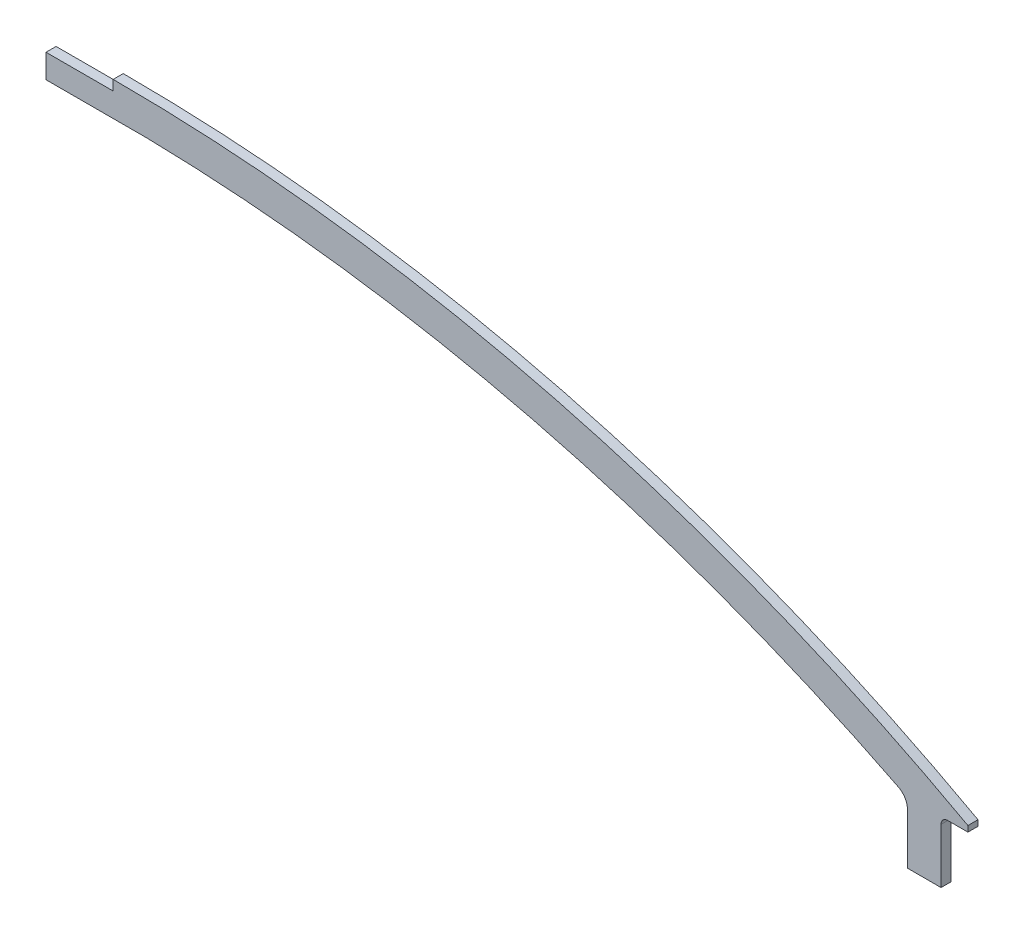
ISO-10303-21;
HEADER;
FILE_DESCRIPTION(('STEP AP214'),'2;1');
FILE_NAME('part.step','',(''),(''),'','','');
FILE_SCHEMA(('AUTOMOTIVE_DESIGN { 1 0 10303 214 1 1 1 1 }'));
ENDSEC;
DATA;
#1=APPLICATION_CONTEXT('core data for automotive mechanical design processes');
#2=APPLICATION_PROTOCOL_DEFINITION('international standard','automotive_design',2000,#1);
#3=PRODUCT_CONTEXT('',#1,'mechanical');
#4=PRODUCT('Part','Part','',(#3));
#5=PRODUCT_RELATED_PRODUCT_CATEGORY('part','',(#4));
#6=PRODUCT_DEFINITION_FORMATION('','',#4);
#7=PRODUCT_DEFINITION_CONTEXT('part definition',#1,'design');
#8=PRODUCT_DEFINITION('design','',#6,#7);
#9=PRODUCT_DEFINITION_SHAPE('','',#8);
#10=(LENGTH_UNIT() NAMED_UNIT(*) SI_UNIT(.MILLI.,.METRE.));
#11=(NAMED_UNIT(*) PLANE_ANGLE_UNIT() SI_UNIT($,.RADIAN.));
#12=(NAMED_UNIT(*) SI_UNIT($,.STERADIAN.) SOLID_ANGLE_UNIT());
#13=UNCERTAINTY_MEASURE_WITH_UNIT(LENGTH_MEASURE(1.E-05),#10,'distance_accuracy_value','');
#14=(GEOMETRIC_REPRESENTATION_CONTEXT(3) GLOBAL_UNCERTAINTY_ASSIGNED_CONTEXT((#13)) GLOBAL_UNIT_ASSIGNED_CONTEXT((#10,
#11,#12)) REPRESENTATION_CONTEXT('',''));
#15=CARTESIAN_POINT('',(0.,0.,0.));
#16=DIRECTION('',(0.,0.,1.));
#17=DIRECTION('',(1.,0.,0.));
#18=AXIS2_PLACEMENT_3D('',#15,#16,#17);
#19=CARTESIAN_POINT('',(45.,-3.5,1.5));
#20=DIRECTION('',(0.,-1.,0.));
#21=DIRECTION('',(1.,0.,0.));
#22=AXIS2_PLACEMENT_3D('',#19,#20,#21);
#23=PLANE('',#22);
#24=DIRECTION('',(-1.,0.,0.));
#25=VECTOR('',#24,1.);
#26=CARTESIAN_POINT('',(45.,-3.5,-1.5));
#27=LINE('',#26,#25);
#28=CARTESIAN_POINT('',(45.,-3.5,-1.5));
#29=VERTEX_POINT('',#28);
#30=CARTESIAN_POINT('',(25.,-3.5,-1.5));
#31=VERTEX_POINT('',#30);
#32=EDGE_CURVE('E196',#29,#31,#27,.T.);
#33=ORIENTED_EDGE('',*,*,#32,.T.);
#34=DIRECTION('',(0.,0.,-1.));
#35=VECTOR('',#34,1.);
#36=CARTESIAN_POINT('',(25.,-3.5,1.5));
#37=LINE('',#36,#35);
#38=CARTESIAN_POINT('',(25.,-3.5,1.5));
#39=VERTEX_POINT('',#38);
#40=EDGE_CURVE('E11',#39,#31,#37,.T.);
#41=ORIENTED_EDGE('',*,*,#40,.F.);
#42=DIRECTION('',(-1.,0.,0.));
#43=VECTOR('',#42,1.);
#44=CARTESIAN_POINT('',(45.,-3.5,1.5));
#45=LINE('',#44,#43);
#46=CARTESIAN_POINT('',(45.,-3.5,1.5));
#47=VERTEX_POINT('',#46);
#48=EDGE_CURVE('E236',#47,#39,#45,.T.);
#49=ORIENTED_EDGE('',*,*,#48,.F.);
#50=DIRECTION('',(0.,0.,-1.));
#51=VECTOR('',#50,1.);
#52=CARTESIAN_POINT('',(45.,-3.5,1.5));
#53=LINE('',#52,#51);
#54=EDGE_CURVE('E192',#47,#29,#53,.T.);
#55=ORIENTED_EDGE('',*,*,#54,.T.);
#56=EDGE_LOOP('',(#33,#41,#49,#55));
#57=FACE_BOUND('',#56,.T.);
#58=ADVANCED_FACE('F47',(#57),#23,.F.);
#59=CARTESIAN_POINT('',(25.,-10.5962249450177,1.5));
#60=DIRECTION('',(1.,0.,0.));
#61=DIRECTION('',(0.,0.,-1.));
#62=AXIS2_PLACEMENT_3D('',#59,#60,#61);
#63=PLANE('',#62);
#64=DIRECTION('',(0.,-1.,0.));
#65=VECTOR('',#64,1.);
#66=CARTESIAN_POINT('',(25.,-10.5962249450177,-1.5));
#67=LINE('',#66,#65);
#68=CARTESIAN_POINT('',(25.,-10.5962249450177,-1.5));
#69=VERTEX_POINT('',#68);
#70=EDGE_CURVE('E200',#31,#69,#67,.T.);
#71=ORIENTED_EDGE('',*,*,#70,.T.);
#72=DIRECTION('',(0.,0.,-1.));
#73=VECTOR('',#72,1.);
#74=CARTESIAN_POINT('',(25.,-10.5962249450177,1.5));
#75=LINE('',#74,#73);
#76=CARTESIAN_POINT('',(25.,-10.5962249450177,1.5));
#77=VERTEX_POINT('',#76);
#78=EDGE_CURVE('E56',#77,#69,#75,.T.);
#79=ORIENTED_EDGE('',*,*,#78,.F.);
#80=DIRECTION('',(0.,-1.,0.));
#81=VECTOR('',#80,1.);
#82=CARTESIAN_POINT('',(25.,-10.5962249450177,1.5));
#83=LINE('',#82,#81);
#84=EDGE_CURVE('E136',#39,#77,#83,.T.);
#85=ORIENTED_EDGE('',*,*,#84,.F.);
#86=ORIENTED_EDGE('',*,*,#40,.T.);
#87=EDGE_LOOP('',(#71,#79,#85,#86));
#88=FACE_BOUND('',#87,.T.);
#89=ADVANCED_FACE('F344',(#88),#63,.F.);
#90=CARTESIAN_POINT('',(54.9033075838229,-10.5962249450177,1.5));
#91=DIRECTION('',(0.,1.,0.));
#92=DIRECTION('',(0.,0.,1.));
#93=AXIS2_PLACEMENT_3D('',#90,#91,#92);
#94=PLANE('',#93);
#95=DIRECTION('',(1.,0.,0.));
#96=VECTOR('',#95,1.);
#97=CARTESIAN_POINT('',(54.9033075838229,-10.5962249450177,-1.5));
#98=LINE('',#97,#96);
#99=CARTESIAN_POINT('',(54.9033075838229,-10.5962249450177,-1.5));
#100=VERTEX_POINT('',#99);
#101=EDGE_CURVE('E203',#69,#100,#98,.T.);
#102=ORIENTED_EDGE('',*,*,#101,.T.);
#103=DIRECTION('',(0.,0.,-1.));
#104=VECTOR('',#103,1.);
#105=CARTESIAN_POINT('',(54.9033075838229,-10.5962249450177,1.5));
#106=LINE('',#105,#104);
#107=CARTESIAN_POINT('',(54.9033075838229,-10.5962249450177,1.5));
#108=VERTEX_POINT('',#107);
#109=EDGE_CURVE('E271',#108,#100,#106,.T.);
#110=ORIENTED_EDGE('',*,*,#109,.F.);
#111=DIRECTION('',(1.,0.,0.));
#112=VECTOR('',#111,1.);
#113=CARTESIAN_POINT('',(54.9033075838229,-10.5962249450177,1.5));
#114=LINE('',#113,#112);
#115=EDGE_CURVE('E281',#77,#108,#114,.T.);
#116=ORIENTED_EDGE('',*,*,#115,.F.);
#117=ORIENTED_EDGE('',*,*,#78,.T.);
#118=EDGE_LOOP('',(#102,#110,#116,#117));
#119=FACE_BOUND('',#118,.T.);
#120=ADVANCED_FACE('F279',(#119),#94,.F.);
#121=CARTESIAN_POINT('',(54.9033075838229,-20.5962249450177,1.5));
#122=DIRECTION('',(0.,0.,-1.));
#123=DIRECTION('',(-1.,0.,0.));
#124=AXIS2_PLACEMENT_3D('',#121,#122,#123);
#125=CYLINDRICAL_SURFACE('',#124,9.99999999999997);
#126=CARTESIAN_POINT('',(54.9033075838229,-20.5962249450177,-1.5));
#127=DIRECTION('',(0.,0.,-1.));
#128=DIRECTION('',(1.,0.,0.));
#129=AXIS2_PLACEMENT_3D('',#126,#127,#128);
#130=CIRCLE('',#129,9.99999999999997);
#131=CARTESIAN_POINT('',(55.0976181422513,-10.5981129529022,-1.5));
#132=VERTEX_POINT('',#131);
#133=EDGE_CURVE('E206',#100,#132,#130,.T.);
#134=ORIENTED_EDGE('',*,*,#133,.T.);
#135=DIRECTION('',(0.,0.,-1.));
#136=VECTOR('',#135,1.);
#137=CARTESIAN_POINT('',(55.0976181422513,-10.5981129529022,1.5));
#138=LINE('',#137,#136);
#139=CARTESIAN_POINT('',(55.0976181422513,-10.5981129529022,1.5));
#140=VERTEX_POINT('',#139);
#141=EDGE_CURVE('E267',#140,#132,#138,.T.);
#142=ORIENTED_EDGE('',*,*,#141,.F.);
#143=CARTESIAN_POINT('',(54.9033075838229,-20.5962249450177,1.5));
#144=DIRECTION('',(0.,0.,-1.));
#145=DIRECTION('',(1.,0.,0.));
#146=AXIS2_PLACEMENT_3D('',#143,#144,#145);
#147=CIRCLE('',#146,9.99999999999997);
#148=EDGE_CURVE('E300',#108,#140,#147,.T.);
#149=ORIENTED_EDGE('',*,*,#148,.F.);
#150=ORIENTED_EDGE('',*,*,#109,.T.);
#151=EDGE_LOOP('',(#134,#142,#149,#150));
#152=FACE_BOUND('',#151,.T.);
#153=ADVANCED_FACE('F290',(#152),#125,.F.);
#154=CARTESIAN_POINT('',(45.,-530.163893918988,1.5));
#155=DIRECTION('',(0.,0.,-1.));
#156=DIRECTION('',(-1.,0.,0.));
#157=AXIS2_PLACEMENT_3D('',#154,#155,#156);
#158=CYLINDRICAL_SURFACE('',#157,519.663893918988);
#159=CARTESIAN_POINT('',(45.,-530.163893918988,-1.5));
#160=DIRECTION('',(0.,0.,-1.));
#161=DIRECTION('',(1.,0.,0.));
#162=AXIS2_PLACEMENT_3D('',#159,#160,#161);
#163=CIRCLE('',#162,519.663893918988);
#164=CARTESIAN_POINT('',(278.749040614032,-66.0389660654361,-1.5));
#165=VERTEX_POINT('',#164);
#166=EDGE_CURVE('E209',#132,#165,#163,.T.);
#167=ORIENTED_EDGE('',*,*,#166,.T.);
#168=DIRECTION('',(0.,0.,-1.));
#169=VECTOR('',#168,1.);
#170=CARTESIAN_POINT('',(278.749040614032,-66.0389660654361,1.5));
#171=LINE('',#170,#169);
#172=CARTESIAN_POINT('',(278.749040614032,-66.0389660654361,1.5));
#173=VERTEX_POINT('',#172);
#174=EDGE_CURVE('E263',#173,#165,#171,.T.);
#175=ORIENTED_EDGE('',*,*,#174,.F.);
#176=CARTESIAN_POINT('',(45.,-530.163893918988,1.5));
#177=DIRECTION('',(0.,0.,-1.));
#178=DIRECTION('',(1.,0.,0.));
#179=AXIS2_PLACEMENT_3D('',#176,#177,#178);
#180=CIRCLE('',#179,519.663893918988);
#181=EDGE_CURVE('E296',#140,#173,#180,.T.);
#182=ORIENTED_EDGE('',*,*,#181,.F.);
#183=ORIENTED_EDGE('',*,*,#141,.T.);
#184=EDGE_LOOP('',(#167,#175,#182,#183));
#185=FACE_BOUND('',#184,.T.);
#186=ADVANCED_FACE('F294',(#185),#158,.F.);
#187=CARTESIAN_POINT('',(276.5,-70.5045921488013,1.5));
#188=DIRECTION('',(0.,0.,-1.));
#189=DIRECTION('',(-1.,0.,0.));
#190=AXIS2_PLACEMENT_3D('',#187,#188,#189);
#191=CYLINDRICAL_SURFACE('',#190,5.00000000000001);
#192=CARTESIAN_POINT('',(276.5,-70.5045921488013,-1.5));
#193=DIRECTION('',(0.,0.,-1.));
#194=DIRECTION('',(1.,0.,0.));
#195=AXIS2_PLACEMENT_3D('',#192,#193,#194);
#196=CIRCLE('',#195,5.00000000000001);
#197=CARTESIAN_POINT('',(281.5,-70.5045921488013,-1.5));
#198=VERTEX_POINT('',#197);
#199=EDGE_CURVE('E212',#165,#198,#196,.T.);
#200=ORIENTED_EDGE('',*,*,#199,.T.);
#201=DIRECTION('',(0.,0.,-1.));
#202=VECTOR('',#201,1.);
#203=CARTESIAN_POINT('',(281.5,-70.5045921488013,1.5));
#204=LINE('',#203,#202);
#205=CARTESIAN_POINT('',(281.5,-70.5045921488013,1.5));
#206=VERTEX_POINT('',#205);
#207=EDGE_CURVE('E259',#206,#198,#204,.T.);
#208=ORIENTED_EDGE('',*,*,#207,.F.);
#209=CARTESIAN_POINT('',(276.5,-70.5045921488013,1.5));
#210=DIRECTION('',(0.,0.,-1.));
#211=DIRECTION('',(1.,0.,0.));
#212=AXIS2_PLACEMENT_3D('',#209,#210,#211);
#213=CIRCLE('',#212,5.00000000000001);
#214=EDGE_CURVE('E299',#173,#206,#213,.T.);
#215=ORIENTED_EDGE('',*,*,#214,.F.);
#216=ORIENTED_EDGE('',*,*,#174,.T.);
#217=EDGE_LOOP('',(#200,#208,#215,#216));
#218=FACE_BOUND('',#217,.T.);
#219=ADVANCED_FACE('F357',(#218),#191,.F.);
#220=CARTESIAN_POINT('',(281.5,-85.6495340533053,1.5));
#221=DIRECTION('',(1.,0.,0.));
#222=DIRECTION('',(0.,0.,-1.));
#223=AXIS2_PLACEMENT_3D('',#220,#221,#222);
#224=PLANE('',#223);
#225=DIRECTION('',(0.,-1.,0.));
#226=VECTOR('',#225,1.);
#227=CARTESIAN_POINT('',(281.5,-85.6495340533053,-1.5));
#228=LINE('',#227,#226);
#229=CARTESIAN_POINT('',(281.5,-85.6495340533053,-1.5));
#230=VERTEX_POINT('',#229);
#231=EDGE_CURVE('E215',#198,#230,#228,.T.);
#232=ORIENTED_EDGE('',*,*,#231,.T.);
#233=DIRECTION('',(0.,0.,-1.));
#234=VECTOR('',#233,1.);
#235=CARTESIAN_POINT('',(281.5,-85.6495340533053,1.5));
#236=LINE('',#235,#234);
#237=CARTESIAN_POINT('',(281.5,-85.6495340533053,1.5));
#238=VERTEX_POINT('',#237);
#239=EDGE_CURVE('E255',#238,#230,#236,.T.);
#240=ORIENTED_EDGE('',*,*,#239,.F.);
#241=DIRECTION('',(0.,-1.,0.));
#242=VECTOR('',#241,1.);
#243=CARTESIAN_POINT('',(281.5,-85.6495340533053,1.5));
#244=LINE('',#243,#242);
#245=EDGE_CURVE('E304',#206,#238,#244,.T.);
#246=ORIENTED_EDGE('',*,*,#245,.F.);
#247=ORIENTED_EDGE('',*,*,#207,.T.);
#248=EDGE_LOOP('',(#232,#240,#246,#247));
#249=FACE_BOUND('',#248,.T.);
#250=ADVANCED_FACE('F360',(#249),#224,.F.);
#251=CARTESIAN_POINT('',(291.5,-85.6495340533053,1.5));
#252=DIRECTION('',(0.,1.,0.));
#253=DIRECTION('',(0.,0.,1.));
#254=AXIS2_PLACEMENT_3D('',#251,#252,#253);
#255=PLANE('',#254);
#256=DIRECTION('',(1.,0.,0.));
#257=VECTOR('',#256,1.);
#258=CARTESIAN_POINT('',(291.5,-85.6495340533053,-1.5));
#259=LINE('',#258,#257);
#260=CARTESIAN_POINT('',(291.5,-85.6495340533053,-1.5));
#261=VERTEX_POINT('',#260);
#262=EDGE_CURVE('E218',#230,#261,#259,.T.);
#263=ORIENTED_EDGE('',*,*,#262,.T.);
#264=DIRECTION('',(0.,0.,-1.));
#265=VECTOR('',#264,1.);
#266=CARTESIAN_POINT('',(291.5,-85.6495340533053,1.5));
#267=LINE('',#266,#265);
#268=CARTESIAN_POINT('',(291.5,-85.6495340533053,1.5));
#269=VERTEX_POINT('',#268);
#270=EDGE_CURVE('E251',#269,#261,#267,.T.);
#271=ORIENTED_EDGE('',*,*,#270,.F.);
#272=DIRECTION('',(1.,0.,0.));
#273=VECTOR('',#272,1.);
#274=CARTESIAN_POINT('',(291.5,-85.6495340533053,1.5));
#275=LINE('',#274,#273);
#276=EDGE_CURVE('E311',#238,#269,#275,.T.);
#277=ORIENTED_EDGE('',*,*,#276,.F.);
#278=ORIENTED_EDGE('',*,*,#239,.T.);
#279=EDGE_LOOP('',(#263,#271,#277,#278));
#280=FACE_BOUND('',#279,.T.);
#281=ADVANCED_FACE('F364',(#280),#255,.F.);
#282=CARTESIAN_POINT('',(291.5,-69.3534439338957,1.5));
#283=DIRECTION('',(-1.,0.,0.));
#284=DIRECTION('',(0.,0.,1.));
#285=AXIS2_PLACEMENT_3D('',#282,#283,#284);
#286=PLANE('',#285);
#287=DIRECTION('',(0.,1.,0.));
#288=VECTOR('',#287,1.);
#289=CARTESIAN_POINT('',(291.5,-69.3534439338957,-1.5));
#290=LINE('',#289,#288);
#291=CARTESIAN_POINT('',(291.5,-69.3534439338957,-1.5));
#292=VERTEX_POINT('',#291);
#293=EDGE_CURVE('E221',#261,#292,#290,.T.);
#294=ORIENTED_EDGE('',*,*,#293,.T.);
#295=DIRECTION('',(0.,0.,-1.));
#296=VECTOR('',#295,1.);
#297=CARTESIAN_POINT('',(291.5,-69.3534439338957,1.5));
#298=LINE('',#297,#296);
#299=CARTESIAN_POINT('',(291.5,-69.3534439338957,1.5));
#300=VERTEX_POINT('',#299);
#301=EDGE_CURVE('E247',#300,#292,#298,.T.);
#302=ORIENTED_EDGE('',*,*,#301,.F.);
#303=DIRECTION('',(0.,1.,0.));
#304=VECTOR('',#303,1.);
#305=CARTESIAN_POINT('',(291.5,-69.3534439338957,1.5));
#306=LINE('',#305,#304);
#307=EDGE_CURVE('E314',#269,#300,#306,.T.);
#308=ORIENTED_EDGE('',*,*,#307,.F.);
#309=ORIENTED_EDGE('',*,*,#270,.T.);
#310=EDGE_LOOP('',(#294,#302,#308,#309));
#311=FACE_BOUND('',#310,.T.);
#312=ADVANCED_FACE('F368',(#311),#286,.F.);
#313=CARTESIAN_POINT('',(293.5,-69.3534439338956,1.5));
#314=DIRECTION('',(0.,0.,-1.));
#315=DIRECTION('',(-1.,0.,0.));
#316=AXIS2_PLACEMENT_3D('',#313,#314,#315);
#317=CYLINDRICAL_SURFACE('',#316,2.);
#318=CARTESIAN_POINT('',(293.5,-69.3534439338956,-1.5));
#319=DIRECTION('',(0.,0.,-1.));
#320=DIRECTION('',(1.,0.,0.));
#321=AXIS2_PLACEMENT_3D('',#318,#319,#320);
#322=CIRCLE('',#321,2.);
#323=CARTESIAN_POINT('',(293.5,-67.3534439338956,-1.5));
#324=VERTEX_POINT('',#323);
#325=EDGE_CURVE('E224',#292,#324,#322,.T.);
#326=ORIENTED_EDGE('',*,*,#325,.T.);
#327=DIRECTION('',(0.,0.,-1.));
#328=VECTOR('',#327,1.);
#329=CARTESIAN_POINT('',(293.5,-67.3534439338956,1.5));
#330=LINE('',#329,#328);
#331=CARTESIAN_POINT('',(293.5,-67.3534439338956,1.5));
#332=VERTEX_POINT('',#331);
#333=EDGE_CURVE('E243',#332,#324,#330,.T.);
#334=ORIENTED_EDGE('',*,*,#333,.F.);
#335=CARTESIAN_POINT('',(293.5,-69.3534439338956,1.5));
#336=DIRECTION('',(0.,0.,-1.));
#337=DIRECTION('',(1.,0.,0.));
#338=AXIS2_PLACEMENT_3D('',#335,#336,#337);
#339=CIRCLE('',#338,2.);
#340=EDGE_CURVE('E317',#300,#332,#339,.T.);
#341=ORIENTED_EDGE('',*,*,#340,.F.);
#342=ORIENTED_EDGE('',*,*,#301,.T.);
#343=EDGE_LOOP('',(#326,#334,#341,#342));
#344=FACE_BOUND('',#343,.T.);
#345=ADVANCED_FACE('F325',(#344),#317,.F.);
#346=CARTESIAN_POINT('',(299.5,-67.3534439338956,1.5));
#347=DIRECTION('',(0.,1.,0.));
#348=DIRECTION('',(0.,0.,1.));
#349=AXIS2_PLACEMENT_3D('',#346,#347,#348);
#350=PLANE('',#349);
#351=DIRECTION('',(1.,0.,0.));
#352=VECTOR('',#351,1.);
#353=CARTESIAN_POINT('',(299.5,-67.3534439338956,-1.5));
#354=LINE('',#353,#352);
#355=CARTESIAN_POINT('',(299.5,-67.3534439338956,-1.5));
#356=VERTEX_POINT('',#355);
#357=EDGE_CURVE('E227',#324,#356,#354,.T.);
#358=ORIENTED_EDGE('',*,*,#357,.T.);
#359=DIRECTION('',(0.,0.,-1.));
#360=VECTOR('',#359,1.);
#361=CARTESIAN_POINT('',(299.5,-67.3534439338956,1.5));
#362=LINE('',#361,#360);
#363=CARTESIAN_POINT('',(299.5,-67.3534439338956,1.5));
#364=VERTEX_POINT('',#363);
#365=EDGE_CURVE('E185',#364,#356,#362,.T.);
#366=ORIENTED_EDGE('',*,*,#365,.F.);
#367=DIRECTION('',(1.,0.,0.));
#368=VECTOR('',#367,1.);
#369=CARTESIAN_POINT('',(299.5,-67.3534439338956,1.5));
#370=LINE('',#369,#368);
#371=EDGE_CURVE('E174',#332,#364,#370,.T.);
#372=ORIENTED_EDGE('',*,*,#371,.F.);
#373=ORIENTED_EDGE('',*,*,#333,.T.);
#374=EDGE_LOOP('',(#358,#366,#372,#373));
#375=FACE_BOUND('',#374,.T.);
#376=ADVANCED_FACE('F329',(#375),#350,.F.);
#377=CARTESIAN_POINT('',(299.5,-65.6495340533053,1.5));
#378=DIRECTION('',(-1.,1.95472138040624E-13,0.));
#379=DIRECTION('',(-1.95472138040624E-13,-1.,0.));
#380=AXIS2_PLACEMENT_3D('',#377,#378,#379);
#381=PLANE('',#380);
#382=DIRECTION('',(1.95472138040624E-13,1.,0.));
#383=VECTOR('',#382,1.);
#384=CARTESIAN_POINT('',(299.5,-65.6495340533053,-1.5));
#385=LINE('',#384,#383);
#386=CARTESIAN_POINT('',(299.5,-65.6495340533053,-1.5));
#387=VERTEX_POINT('',#386);
#388=EDGE_CURVE('E183',#356,#387,#385,.T.);
#389=ORIENTED_EDGE('',*,*,#388,.T.);
#390=DIRECTION('',(0.,0.,-1.));
#391=VECTOR('',#390,1.);
#392=CARTESIAN_POINT('',(299.5,-65.6495340533053,1.5));
#393=LINE('',#392,#391);
#394=CARTESIAN_POINT('',(299.5,-65.6495340533053,1.5));
#395=VERTEX_POINT('',#394);
#396=EDGE_CURVE('E180',#395,#387,#393,.T.);
#397=ORIENTED_EDGE('',*,*,#396,.F.);
#398=DIRECTION('',(1.95472138040624E-13,1.,0.));
#399=VECTOR('',#398,1.);
#400=CARTESIAN_POINT('',(299.5,-65.6495340533053,1.5));
#401=LINE('',#400,#399);
#402=EDGE_CURVE('E168',#364,#395,#401,.T.);
#403=ORIENTED_EDGE('',*,*,#402,.F.);
#404=ORIENTED_EDGE('',*,*,#365,.T.);
#405=EDGE_LOOP('',(#389,#397,#403,#404));
#406=FACE_BOUND('',#405,.T.);
#407=ADVANCED_FACE('F181',(#406),#381,.F.);
#408=CARTESIAN_POINT('',(45.,-530.163893918988,1.5));
#409=DIRECTION('',(0.,0.,-1.));
#410=DIRECTION('',(-1.,0.,0.));
#411=AXIS2_PLACEMENT_3D('',#408,#409,#410);
#412=CYLINDRICAL_SURFACE('',#411,529.663893918988);
#413=CARTESIAN_POINT('',(45.,-530.163893918988,-1.5));
#414=DIRECTION('',(0.,0.,1.));
#415=DIRECTION('',(1.,0.,0.));
#416=AXIS2_PLACEMENT_3D('',#413,#414,#415);
#417=CIRCLE('',#416,529.663893918988);
#418=CARTESIAN_POINT('',(45.,-0.5,-1.5));
#419=VERTEX_POINT('',#418);
#420=EDGE_CURVE('E119',#387,#419,#417,.T.);
#421=ORIENTED_EDGE('',*,*,#420,.T.);
#422=DIRECTION('',(0.,0.,-1.));
#423=VECTOR('',#422,1.);
#424=CARTESIAN_POINT('',(45.,-0.5,1.5));
#425=LINE('',#424,#423);
#426=CARTESIAN_POINT('',(45.,-0.5,1.5));
#427=VERTEX_POINT('',#426);
#428=EDGE_CURVE('E186',#427,#419,#425,.T.);
#429=ORIENTED_EDGE('',*,*,#428,.F.);
#430=CARTESIAN_POINT('',(45.,-530.163893918988,1.5));
#431=DIRECTION('',(0.,0.,1.));
#432=DIRECTION('',(1.,0.,0.));
#433=AXIS2_PLACEMENT_3D('',#430,#431,#432);
#434=CIRCLE('',#433,529.663893918988);
#435=EDGE_CURVE('E172',#395,#427,#434,.T.);
#436=ORIENTED_EDGE('',*,*,#435,.F.);
#437=ORIENTED_EDGE('',*,*,#396,.T.);
#438=EDGE_LOOP('',(#421,#429,#436,#437));
#439=FACE_BOUND('',#438,.T.);
#440=ADVANCED_FACE('F188',(#439),#412,.T.);
#441=CARTESIAN_POINT('',(45.,-0.5,1.5));
#442=DIRECTION('',(1.,0.,0.));
#443=DIRECTION('',(0.,0.,-1.));
#444=AXIS2_PLACEMENT_3D('',#441,#442,#443);
#445=PLANE('',#444);
#446=DIRECTION('',(0.,-1.,0.));
#447=VECTOR('',#446,1.);
#448=CARTESIAN_POINT('',(45.,-0.5,-1.5));
#449=LINE('',#448,#447);
#450=EDGE_CURVE('E126',#419,#29,#449,.T.);
#451=ORIENTED_EDGE('',*,*,#450,.T.);
#452=ORIENTED_EDGE('',*,*,#54,.F.);
#453=DIRECTION('',(0.,-1.,0.));
#454=VECTOR('',#453,1.);
#455=CARTESIAN_POINT('',(45.,-0.5,1.5));
#456=LINE('',#455,#454);
#457=EDGE_CURVE('E67',#427,#47,#456,.T.);
#458=ORIENTED_EDGE('',*,*,#457,.F.);
#459=ORIENTED_EDGE('',*,*,#428,.T.);
#460=EDGE_LOOP('',(#451,#452,#458,#459));
#461=FACE_BOUND('',#460,.T.);
#462=ADVANCED_FACE('F333',(#461),#445,.F.);
#463=CARTESIAN_POINT('',(54.9033075838229,-20.5962249450177,1.5));
#464=DIRECTION('',(0.,0.,1.));
#465=DIRECTION('',(1.,0.,0.));
#466=AXIS2_PLACEMENT_3D('',#463,#464,#465);
#467=PLANE('',#466);
#468=ORIENTED_EDGE('',*,*,#48,.T.);
#469=ORIENTED_EDGE('',*,*,#84,.T.);
#470=ORIENTED_EDGE('',*,*,#115,.T.);
#471=ORIENTED_EDGE('',*,*,#148,.T.);
#472=ORIENTED_EDGE('',*,*,#181,.T.);
#473=ORIENTED_EDGE('',*,*,#214,.T.);
#474=ORIENTED_EDGE('',*,*,#245,.T.);
#475=ORIENTED_EDGE('',*,*,#276,.T.);
#476=ORIENTED_EDGE('',*,*,#307,.T.);
#477=ORIENTED_EDGE('',*,*,#340,.T.);
#478=ORIENTED_EDGE('',*,*,#371,.T.);
#479=ORIENTED_EDGE('',*,*,#402,.T.);
#480=ORIENTED_EDGE('',*,*,#435,.T.);
#481=ORIENTED_EDGE('',*,*,#457,.T.);
#482=EDGE_LOOP('',(#468,#469,#470,#471,#472,#473,#474,#475,#476,#477,#478,#479,#480,#481));
#483=FACE_BOUND('',#482,.T.);
#484=ADVANCED_FACE('F170',(#483),#467,.T.);
#485=CARTESIAN_POINT('',(54.9033075838229,-20.5962249450177,-1.5));
#486=DIRECTION('',(0.,0.,1.));
#487=DIRECTION('',(1.,0.,0.));
#488=AXIS2_PLACEMENT_3D('',#485,#486,#487);
#489=PLANE('',#488);
#490=ORIENTED_EDGE('',*,*,#32,.F.);
#491=ORIENTED_EDGE('',*,*,#450,.F.);
#492=ORIENTED_EDGE('',*,*,#420,.F.);
#493=ORIENTED_EDGE('',*,*,#388,.F.);
#494=ORIENTED_EDGE('',*,*,#357,.F.);
#495=ORIENTED_EDGE('',*,*,#325,.F.);
#496=ORIENTED_EDGE('',*,*,#293,.F.);
#497=ORIENTED_EDGE('',*,*,#262,.F.);
#498=ORIENTED_EDGE('',*,*,#231,.F.);
#499=ORIENTED_EDGE('',*,*,#199,.F.);
#500=ORIENTED_EDGE('',*,*,#166,.F.);
#501=ORIENTED_EDGE('',*,*,#133,.F.);
#502=ORIENTED_EDGE('',*,*,#101,.F.);
#503=ORIENTED_EDGE('',*,*,#70,.F.);
#504=EDGE_LOOP('',(#490,#491,#492,#493,#494,#495,#496,#497,#498,#499,#500,#501,#502,#503));
#505=FACE_BOUND('',#504,.T.);
#506=ADVANCED_FACE('F285',(#505),#489,.F.);
#507=CLOSED_SHELL('',(#58,#89,#120,#153,#186,#219,#250,#281,#312,#345,#376,#407,#440,#462,#484,#506));
#508=MANIFOLD_SOLID_BREP('B2',#507);
#509=ADVANCED_BREP_SHAPE_REPRESENTATION('',(#18,#508),#14);
#510=SHAPE_DEFINITION_REPRESENTATION(#9,#509);
ENDSEC;
END-ISO-10303-21;
